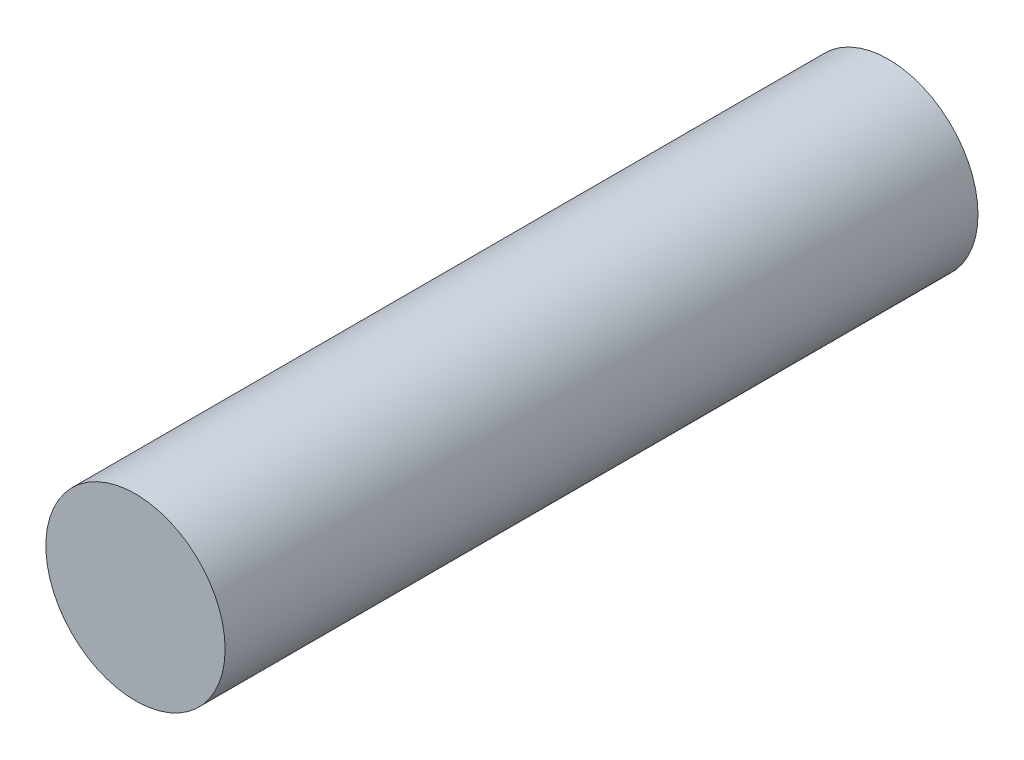
ISO-10303-21;
HEADER;
FILE_DESCRIPTION(('STEP AP214'),'2;1');
FILE_NAME('part.step','',(''),(''),'','','');
FILE_SCHEMA(('AUTOMOTIVE_DESIGN { 1 0 10303 214 1 1 1 1 }'));
ENDSEC;
DATA;
#1=APPLICATION_CONTEXT('core data for automotive mechanical design processes');
#2=APPLICATION_PROTOCOL_DEFINITION('international standard','automotive_design',2000,#1);
#3=PRODUCT_CONTEXT('',#1,'mechanical');
#4=PRODUCT('Part','Part','',(#3));
#5=PRODUCT_RELATED_PRODUCT_CATEGORY('part','',(#4));
#6=PRODUCT_DEFINITION_FORMATION('','',#4);
#7=PRODUCT_DEFINITION_CONTEXT('part definition',#1,'design');
#8=PRODUCT_DEFINITION('design','',#6,#7);
#9=PRODUCT_DEFINITION_SHAPE('','',#8);
#10=(LENGTH_UNIT() NAMED_UNIT(*) SI_UNIT(.MILLI.,.METRE.));
#11=(NAMED_UNIT(*) PLANE_ANGLE_UNIT() SI_UNIT($,.RADIAN.));
#12=(NAMED_UNIT(*) SI_UNIT($,.STERADIAN.) SOLID_ANGLE_UNIT());
#13=UNCERTAINTY_MEASURE_WITH_UNIT(LENGTH_MEASURE(1.E-05),#10,'distance_accuracy_value','');
#14=(GEOMETRIC_REPRESENTATION_CONTEXT(3) GLOBAL_UNCERTAINTY_ASSIGNED_CONTEXT((#13)) GLOBAL_UNIT_ASSIGNED_CONTEXT((#10,
#11,#12)) REPRESENTATION_CONTEXT('',''));
#15=CARTESIAN_POINT('',(0.,0.,0.));
#16=DIRECTION('',(0.,0.,1.));
#17=DIRECTION('',(1.,0.,0.));
#18=AXIS2_PLACEMENT_3D('',#15,#16,#17);
#19=CARTESIAN_POINT('',(0.,0.,20.));
#20=DIRECTION('',(0.,0.,-1.));
#21=DIRECTION('',(-1.,0.,0.));
#22=AXIS2_PLACEMENT_3D('',#19,#20,#21);
#23=CYLINDRICAL_SURFACE('',#22,4.7625);
#24=CARTESIAN_POINT('',(0.,0.,20.));
#25=DIRECTION('',(0.,0.,1.));
#26=DIRECTION('',(1.,0.,0.));
#27=AXIS2_PLACEMENT_3D('',#24,#25,#26);
#28=CIRCLE('',#27,4.7625);
#29=CARTESIAN_POINT('',(4.7625,0.,20.));
#30=VERTEX_POINT('',#29);
#31=EDGE_CURVE('E10',#30,#30,#28,.T.);
#32=ORIENTED_EDGE('',*,*,#31,.F.);
#33=EDGE_LOOP('',(#32));
#34=FACE_BOUND('',#33,.T.);
#35=CARTESIAN_POINT('',(0.,0.,-20.));
#36=DIRECTION('',(0.,0.,1.));
#37=DIRECTION('',(1.,0.,0.));
#38=AXIS2_PLACEMENT_3D('',#35,#36,#37);
#39=CIRCLE('',#38,4.7625);
#40=CARTESIAN_POINT('',(4.7625,0.,-20.));
#41=VERTEX_POINT('',#40);
#42=EDGE_CURVE('E38',#41,#41,#39,.T.);
#43=ORIENTED_EDGE('',*,*,#42,.T.);
#44=EDGE_LOOP('',(#43));
#45=FACE_BOUND('',#44,.T.);
#46=ADVANCED_FACE('F35',(#34,#45),#23,.T.);
#47=CARTESIAN_POINT('',(0.,0.,20.));
#48=DIRECTION('',(0.,0.,1.));
#49=DIRECTION('',(1.,0.,0.));
#50=AXIS2_PLACEMENT_3D('',#47,#48,#49);
#51=PLANE('',#50);
#52=ORIENTED_EDGE('',*,*,#31,.T.);
#53=EDGE_LOOP('',(#52));
#54=FACE_BOUND('',#53,.T.);
#55=ADVANCED_FACE('F50',(#54),#51,.T.);
#56=CARTESIAN_POINT('',(0.,0.,-20.));
#57=DIRECTION('',(0.,0.,1.));
#58=DIRECTION('',(1.,0.,0.));
#59=AXIS2_PLACEMENT_3D('',#56,#57,#58);
#60=PLANE('',#59);
#61=ORIENTED_EDGE('',*,*,#42,.F.);
#62=EDGE_LOOP('',(#61));
#63=FACE_BOUND('',#62,.T.);
#64=ADVANCED_FACE('F48',(#63),#60,.F.);
#65=CLOSED_SHELL('',(#46,#55,#64));
#66=MANIFOLD_SOLID_BREP('B2',#65);
#67=ADVANCED_BREP_SHAPE_REPRESENTATION('',(#18,#66),#14);
#68=SHAPE_DEFINITION_REPRESENTATION(#9,#67);
ENDSEC;
END-ISO-10303-21;
